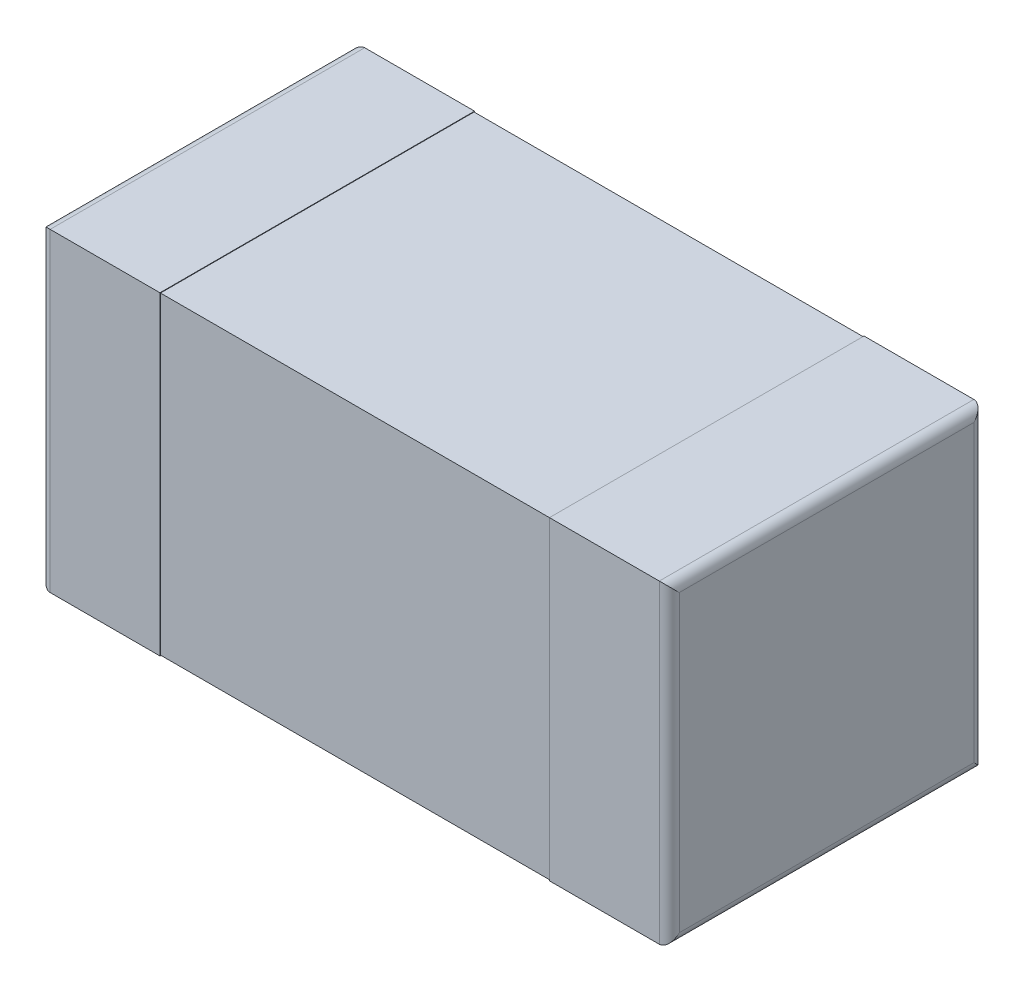
ISO-10303-21;
HEADER;
FILE_DESCRIPTION(('STEP AP214'),'2;1');
FILE_NAME('part.step','',(''),(''),'','','');
FILE_SCHEMA(('AUTOMOTIVE_DESIGN { 1 0 10303 214 1 1 1 1 }'));
ENDSEC;
DATA;
#1=APPLICATION_CONTEXT('core data for automotive mechanical design processes');
#2=APPLICATION_PROTOCOL_DEFINITION('international standard','automotive_design',2000,#1);
#3=PRODUCT_CONTEXT('',#1,'mechanical');
#4=PRODUCT('Part','Part','',(#3));
#5=PRODUCT_RELATED_PRODUCT_CATEGORY('part','',(#4));
#6=PRODUCT_DEFINITION_FORMATION('','',#4);
#7=PRODUCT_DEFINITION_CONTEXT('part definition',#1,'design');
#8=PRODUCT_DEFINITION('design','',#6,#7);
#9=PRODUCT_DEFINITION_SHAPE('','',#8);
#10=(LENGTH_UNIT() NAMED_UNIT(*) SI_UNIT(.MILLI.,.METRE.));
#11=(NAMED_UNIT(*) PLANE_ANGLE_UNIT() SI_UNIT($,.RADIAN.));
#12=(NAMED_UNIT(*) SI_UNIT($,.STERADIAN.) SOLID_ANGLE_UNIT());
#13=UNCERTAINTY_MEASURE_WITH_UNIT(LENGTH_MEASURE(1.E-05),#10,'distance_accuracy_value','');
#14=(GEOMETRIC_REPRESENTATION_CONTEXT(3) GLOBAL_UNCERTAINTY_ASSIGNED_CONTEXT((#13)) GLOBAL_UNIT_ASSIGNED_CONTEXT((#10,
#11,#12)) REPRESENTATION_CONTEXT('',''));
#15=CARTESIAN_POINT('',(0.,0.,0.));
#16=DIRECTION('',(0.,0.,1.));
#17=DIRECTION('',(1.,0.,0.));
#18=AXIS2_PLACEMENT_3D('',#15,#16,#17);
#19=CARTESIAN_POINT('',(3.1496,1.5494,1.6002));
#20=DIRECTION('',(0.,0.,-1.));
#21=DIRECTION('',(-1.,0.,0.));
#22=AXIS2_PLACEMENT_3D('',#19,#20,#21);
#23=CYLINDRICAL_SURFACE('',#22,0.0508);
#24=CARTESIAN_POINT('',(3.1496,1.5494,1.5494));
#25=DIRECTION('',(0.,0.707106781186548,-0.707106781186548));
#26=DIRECTION('',(0.,-0.707106781186548,-0.707106781186548));
#27=AXIS2_PLACEMENT_3D('',#24,#25,#26);
#28=ELLIPSE('',#27,0.0718420489685533,0.0508);
#29=CARTESIAN_POINT('',(3.1496,1.6002,1.6002));
#30=VERTEX_POINT('',#29);
#31=CARTESIAN_POINT('',(3.2004,1.5494,1.5494));
#32=VERTEX_POINT('',#31);
#33=EDGE_CURVE('E28',#30,#32,#28,.T.);
#34=ORIENTED_EDGE('',*,*,#33,.T.);
#35=DIRECTION('',(0.,0.,1.));
#36=VECTOR('',#35,1.);
#37=CARTESIAN_POINT('',(3.2004,1.5494,1.6002));
#38=LINE('',#37,#36);
#39=CARTESIAN_POINT('',(3.2004,1.5494,0.0508));
#40=VERTEX_POINT('',#39);
#41=EDGE_CURVE('E265',#40,#32,#38,.T.);
#42=ORIENTED_EDGE('',*,*,#41,.F.);
#43=CARTESIAN_POINT('',(3.1496,1.5494,0.0508));
#44=DIRECTION('',(0.,0.707106781186548,0.707106781186548));
#45=DIRECTION('',(0.,0.707106781186548,-0.707106781186548));
#46=AXIS2_PLACEMENT_3D('',#43,#44,#45);
#47=ELLIPSE('',#46,0.0718420489685533,0.0508);
#48=CARTESIAN_POINT('',(3.1496,1.6002,0.));
#49=VERTEX_POINT('',#48);
#50=EDGE_CURVE('E11',#40,#49,#47,.T.);
#51=ORIENTED_EDGE('',*,*,#50,.T.);
#52=DIRECTION('',(0.,0.,-1.));
#53=VECTOR('',#52,1.);
#54=CARTESIAN_POINT('',(3.1496,1.6002,1.6002));
#55=LINE('',#54,#53);
#56=EDGE_CURVE('E304',#30,#49,#55,.T.);
#57=ORIENTED_EDGE('',*,*,#56,.F.);
#58=EDGE_LOOP('',(#34,#42,#51,#57));
#59=FACE_BOUND('',#58,.T.);
#60=ADVANCED_FACE('F17',(#59),#23,.T.);
#61=CARTESIAN_POINT('',(3.1496,0.,0.0508));
#62=DIRECTION('',(0.,1.,0.));
#63=DIRECTION('',(0.,0.,1.));
#64=AXIS2_PLACEMENT_3D('',#61,#62,#63);
#65=CYLINDRICAL_SURFACE('',#64,0.0508);
#66=CARTESIAN_POINT('',(3.1496,0.0508,0.0508));
#67=DIRECTION('',(0.,0.707106781186548,-0.707106781186548));
#68=DIRECTION('',(0.,-0.707106781186548,-0.707106781186548));
#69=AXIS2_PLACEMENT_3D('',#66,#67,#68);
#70=ELLIPSE('',#69,0.0718420489685533,0.0508);
#71=CARTESIAN_POINT('',(3.2004,0.0508,0.0508));
#72=VERTEX_POINT('',#71);
#73=CARTESIAN_POINT('',(3.1496,0.,0.));
#74=VERTEX_POINT('',#73);
#75=EDGE_CURVE('E330',#72,#74,#70,.T.);
#76=ORIENTED_EDGE('',*,*,#75,.T.);
#77=DIRECTION('',(0.,-1.,0.));
#78=VECTOR('',#77,1.);
#79=CARTESIAN_POINT('',(3.1496,0.,0.));
#80=LINE('',#79,#78);
#81=EDGE_CURVE('E227',#49,#74,#80,.T.);
#82=ORIENTED_EDGE('',*,*,#81,.F.);
#83=ORIENTED_EDGE('',*,*,#50,.F.);
#84=DIRECTION('',(0.,1.,0.));
#85=VECTOR('',#84,1.);
#86=CARTESIAN_POINT('',(3.2004,0.,0.0508));
#87=LINE('',#86,#85);
#88=EDGE_CURVE('E261',#72,#40,#87,.T.);
#89=ORIENTED_EDGE('',*,*,#88,.F.);
#90=EDGE_LOOP('',(#76,#82,#83,#89));
#91=FACE_BOUND('',#90,.T.);
#92=ADVANCED_FACE('F392',(#91),#65,.T.);
#93=CARTESIAN_POINT('',(3.1496,0.,1.5494));
#94=DIRECTION('',(0.,-1.,0.));
#95=DIRECTION('',(0.,0.,-1.));
#96=AXIS2_PLACEMENT_3D('',#93,#94,#95);
#97=CYLINDRICAL_SURFACE('',#96,0.0508);
#98=CARTESIAN_POINT('',(3.1496,0.0508,1.5494));
#99=DIRECTION('',(0.,0.707106781186548,0.707106781186548));
#100=DIRECTION('',(0.,0.707106781186548,-0.707106781186548));
#101=AXIS2_PLACEMENT_3D('',#98,#99,#100);
#102=ELLIPSE('',#101,0.0718420489685533,0.0508);
#103=CARTESIAN_POINT('',(3.1496,0.,1.6002));
#104=VERTEX_POINT('',#103);
#105=CARTESIAN_POINT('',(3.2004,0.0508,1.5494));
#106=VERTEX_POINT('',#105);
#107=EDGE_CURVE('E42',#104,#106,#102,.T.);
#108=ORIENTED_EDGE('',*,*,#107,.T.);
#109=DIRECTION('',(0.,-1.,0.));
#110=VECTOR('',#109,1.);
#111=CARTESIAN_POINT('',(3.2004,0.,1.5494));
#112=LINE('',#111,#110);
#113=EDGE_CURVE('E287',#32,#106,#112,.T.);
#114=ORIENTED_EDGE('',*,*,#113,.F.);
#115=ORIENTED_EDGE('',*,*,#33,.F.);
#116=DIRECTION('',(0.,1.,0.));
#117=VECTOR('',#116,1.);
#118=CARTESIAN_POINT('',(3.1496,1.6002,1.6002));
#119=LINE('',#118,#117);
#120=EDGE_CURVE('E256',#104,#30,#119,.T.);
#121=ORIENTED_EDGE('',*,*,#120,.F.);
#122=EDGE_LOOP('',(#108,#114,#115,#121));
#123=FACE_BOUND('',#122,.T.);
#124=ADVANCED_FACE('F425',(#123),#97,.T.);
#125=CARTESIAN_POINT('',(3.1496,0.0508,1.6002));
#126=DIRECTION('',(0.,0.,-1.));
#127=DIRECTION('',(-1.,0.,0.));
#128=AXIS2_PLACEMENT_3D('',#125,#126,#127);
#129=CYLINDRICAL_SURFACE('',#128,0.0508);
#130=ORIENTED_EDGE('',*,*,#75,.F.);
#131=DIRECTION('',(0.,0.,-1.));
#132=VECTOR('',#131,1.);
#133=CARTESIAN_POINT('',(3.2004,0.0508,1.6002));
#134=LINE('',#133,#132);
#135=EDGE_CURVE('E282',#106,#72,#134,.T.);
#136=ORIENTED_EDGE('',*,*,#135,.F.);
#137=ORIENTED_EDGE('',*,*,#107,.F.);
#138=DIRECTION('',(0.,0.,1.));
#139=VECTOR('',#138,1.);
#140=CARTESIAN_POINT('',(3.1496,0.,1.6002));
#141=LINE('',#140,#139);
#142=EDGE_CURVE('E231',#74,#104,#141,.T.);
#143=ORIENTED_EDGE('',*,*,#142,.F.);
#144=EDGE_LOOP('',(#130,#136,#137,#143));
#145=FACE_BOUND('',#144,.T.);
#146=ADVANCED_FACE('F19',(#145),#129,.T.);
#147=CARTESIAN_POINT('',(0.0508,0.0508,1.6002));
#148=DIRECTION('',(0.,0.,-1.));
#149=DIRECTION('',(-1.,0.,0.));
#150=AXIS2_PLACEMENT_3D('',#147,#148,#149);
#151=CYLINDRICAL_SURFACE('',#150,0.0508);
#152=CARTESIAN_POINT('',(0.0508,0.0508,1.5494));
#153=DIRECTION('',(0.,-0.707106781186548,-0.707106781186548));
#154=DIRECTION('',(0.,0.707106781186548,-0.707106781186548));
#155=AXIS2_PLACEMENT_3D('',#152,#153,#154);
#156=ELLIPSE('',#155,0.0718420489685533,0.0508);
#157=CARTESIAN_POINT('',(0.0508,0.,1.6002));
#158=VERTEX_POINT('',#157);
#159=CARTESIAN_POINT('',(0.,0.0508,1.5494));
#160=VERTEX_POINT('',#159);
#161=EDGE_CURVE('E297',#158,#160,#156,.T.);
#162=ORIENTED_EDGE('',*,*,#161,.T.);
#163=DIRECTION('',(0.,0.,1.));
#164=VECTOR('',#163,1.);
#165=CARTESIAN_POINT('',(0.,0.0508,1.6002));
#166=LINE('',#165,#164);
#167=CARTESIAN_POINT('',(0.,0.0508,0.0508));
#168=VERTEX_POINT('',#167);
#169=EDGE_CURVE('E278',#168,#160,#166,.T.);
#170=ORIENTED_EDGE('',*,*,#169,.F.);
#171=CARTESIAN_POINT('',(0.0508,0.0508,0.0508));
#172=DIRECTION('',(0.,-0.707106781186548,0.707106781186548));
#173=DIRECTION('',(0.,-0.707106781186548,-0.707106781186548));
#174=AXIS2_PLACEMENT_3D('',#171,#172,#173);
#175=ELLIPSE('',#174,0.0718420489685533,0.0508);
#176=CARTESIAN_POINT('',(0.0508,0.,0.));
#177=VERTEX_POINT('',#176);
#178=EDGE_CURVE('E300',#168,#177,#175,.T.);
#179=ORIENTED_EDGE('',*,*,#178,.T.);
#180=DIRECTION('',(0.,0.,-1.));
#181=VECTOR('',#180,1.);
#182=CARTESIAN_POINT('',(0.0508,0.,1.6002));
#183=LINE('',#182,#181);
#184=EDGE_CURVE('E232',#158,#177,#183,.T.);
#185=ORIENTED_EDGE('',*,*,#184,.F.);
#186=EDGE_LOOP('',(#162,#170,#179,#185));
#187=FACE_BOUND('',#186,.T.);
#188=ADVANCED_FACE('F429',(#187),#151,.T.);
#189=CARTESIAN_POINT('',(0.0508,1.6002,0.0508));
#190=DIRECTION('',(0.,-1.,0.));
#191=DIRECTION('',(1.,0.,0.));
#192=AXIS2_PLACEMENT_3D('',#189,#190,#191);
#193=CYLINDRICAL_SURFACE('',#192,0.0508);
#194=CARTESIAN_POINT('',(0.0508,1.5494,0.0508));
#195=DIRECTION('',(0.,-0.707106781186548,-0.707106781186548));
#196=DIRECTION('',(0.,0.707106781186548,-0.707106781186548));
#197=AXIS2_PLACEMENT_3D('',#194,#195,#196);
#198=ELLIPSE('',#197,0.0718420489685533,0.0508);
#199=CARTESIAN_POINT('',(0.,1.5494,0.0508));
#200=VERTEX_POINT('',#199);
#201=CARTESIAN_POINT('',(0.0508,1.6002,0.));
#202=VERTEX_POINT('',#201);
#203=EDGE_CURVE('E180',#200,#202,#198,.T.);
#204=ORIENTED_EDGE('',*,*,#203,.T.);
#205=DIRECTION('',(0.,1.,0.));
#206=VECTOR('',#205,1.);
#207=CARTESIAN_POINT('',(0.0508,0.,0.));
#208=LINE('',#207,#206);
#209=EDGE_CURVE('E312',#177,#202,#208,.T.);
#210=ORIENTED_EDGE('',*,*,#209,.F.);
#211=ORIENTED_EDGE('',*,*,#178,.F.);
#212=DIRECTION('',(0.,-1.,0.));
#213=VECTOR('',#212,1.);
#214=CARTESIAN_POINT('',(0.,1.6002,0.0508));
#215=LINE('',#214,#213);
#216=EDGE_CURVE('E274',#200,#168,#215,.T.);
#217=ORIENTED_EDGE('',*,*,#216,.F.);
#218=EDGE_LOOP('',(#204,#210,#211,#217));
#219=FACE_BOUND('',#218,.T.);
#220=ADVANCED_FACE('F438',(#219),#193,.T.);
#221=CARTESIAN_POINT('',(0.0508,0.,1.5494));
#222=DIRECTION('',(0.,1.,0.));
#223=DIRECTION('',(-1.,0.,0.));
#224=AXIS2_PLACEMENT_3D('',#221,#222,#223);
#225=CYLINDRICAL_SURFACE('',#224,0.0508);
#226=CARTESIAN_POINT('',(0.0508,1.5494,1.5494));
#227=DIRECTION('',(0.,-0.707106781186548,0.707106781186548));
#228=DIRECTION('',(0.,-0.707106781186548,-0.707106781186548));
#229=AXIS2_PLACEMENT_3D('',#226,#227,#228);
#230=ELLIPSE('',#229,0.0718420489685533,0.0508);
#231=CARTESIAN_POINT('',(0.0508,1.6002,1.6002));
#232=VERTEX_POINT('',#231);
#233=CARTESIAN_POINT('',(0.,1.5494,1.5494));
#234=VERTEX_POINT('',#233);
#235=EDGE_CURVE('E301',#232,#234,#230,.T.);
#236=ORIENTED_EDGE('',*,*,#235,.T.);
#237=DIRECTION('',(0.,1.,0.));
#238=VECTOR('',#237,1.);
#239=CARTESIAN_POINT('',(0.,1.6002,1.5494));
#240=LINE('',#239,#238);
#241=EDGE_CURVE('E311',#160,#234,#240,.T.);
#242=ORIENTED_EDGE('',*,*,#241,.F.);
#243=ORIENTED_EDGE('',*,*,#161,.F.);
#244=DIRECTION('',(0.,-1.,0.));
#245=VECTOR('',#244,1.);
#246=CARTESIAN_POINT('',(0.0508,0.,1.6002));
#247=LINE('',#246,#245);
#248=EDGE_CURVE('E269',#232,#158,#247,.T.);
#249=ORIENTED_EDGE('',*,*,#248,.F.);
#250=EDGE_LOOP('',(#236,#242,#243,#249));
#251=FACE_BOUND('',#250,.T.);
#252=ADVANCED_FACE('F434',(#251),#225,.T.);
#253=CARTESIAN_POINT('',(0.0508,1.5494,1.6002));
#254=DIRECTION('',(0.,0.,-1.));
#255=DIRECTION('',(-1.,0.,0.));
#256=AXIS2_PLACEMENT_3D('',#253,#254,#255);
#257=CYLINDRICAL_SURFACE('',#256,0.0508);
#258=ORIENTED_EDGE('',*,*,#203,.F.);
#259=DIRECTION('',(0.,0.,-1.));
#260=VECTOR('',#259,1.);
#261=CARTESIAN_POINT('',(0.,1.5494,1.6002));
#262=LINE('',#261,#260);
#263=EDGE_CURVE('E266',#234,#200,#262,.T.);
#264=ORIENTED_EDGE('',*,*,#263,.F.);
#265=ORIENTED_EDGE('',*,*,#235,.F.);
#266=DIRECTION('',(0.,0.,1.));
#267=VECTOR('',#266,1.);
#268=CARTESIAN_POINT('',(0.0508,1.6002,1.6002));
#269=LINE('',#268,#267);
#270=EDGE_CURVE('E21',#202,#232,#269,.T.);
#271=ORIENTED_EDGE('',*,*,#270,.F.);
#272=EDGE_LOOP('',(#258,#264,#265,#271));
#273=FACE_BOUND('',#272,.T.);
#274=ADVANCED_FACE('F437',(#273),#257,.T.);
#275=CARTESIAN_POINT('',(0.6096,3.91967348640164,0.00253999999999982));
#276=DIRECTION('',(0.,0.,-1.));
#277=DIRECTION('',(0.,-1.,0.));
#278=AXIS2_PLACEMENT_3D('',#275,#276,#277);
#279=PLANE('',#278);
#280=DIRECTION('',(-1.,0.,0.));
#281=VECTOR('',#280,1.);
#282=CARTESIAN_POINT('',(2.5908,0.00254000000000018,0.00253999999999966));
#283=LINE('',#282,#281);
#284=CARTESIAN_POINT('',(2.5908,0.00253999999999966,0.00253999999999982));
#285=VERTEX_POINT('',#284);
#286=CARTESIAN_POINT('',(0.6096,0.00253999999999966,0.00253999999999982));
#287=VERTEX_POINT('',#286);
#288=EDGE_CURVE('E217',#285,#287,#283,.T.);
#289=ORIENTED_EDGE('',*,*,#288,.T.);
#290=DIRECTION('',(0.,-1.,0.));
#291=VECTOR('',#290,1.);
#292=CARTESIAN_POINT('',(0.6096,3.91967348640164,0.00253999999999982));
#293=LINE('',#292,#291);
#294=CARTESIAN_POINT('',(0.6096,1.59766,0.00253999999999982));
#295=VERTEX_POINT('',#294);
#296=EDGE_CURVE('E286',#295,#287,#293,.T.);
#297=ORIENTED_EDGE('',*,*,#296,.F.);
#298=DIRECTION('',(1.,0.,0.));
#299=VECTOR('',#298,1.);
#300=CARTESIAN_POINT('',(0.6096,1.59766,0.00253999999999966));
#301=LINE('',#300,#299);
#302=CARTESIAN_POINT('',(2.5908,1.59766,0.00253999999999982));
#303=VERTEX_POINT('',#302);
#304=EDGE_CURVE('E333',#295,#303,#301,.T.);
#305=ORIENTED_EDGE('',*,*,#304,.T.);
#306=DIRECTION('',(0.,-1.,0.));
#307=VECTOR('',#306,1.);
#308=CARTESIAN_POINT('',(2.5908,3.91967348640164,0.00253999999999982));
#309=LINE('',#308,#307);
#310=EDGE_CURVE('E205',#303,#285,#309,.T.);
#311=ORIENTED_EDGE('',*,*,#310,.T.);
#312=EDGE_LOOP('',(#289,#297,#305,#311));
#313=FACE_BOUND('',#312,.T.);
#314=ADVANCED_FACE('F454',(#313),#279,.T.);
#315=CARTESIAN_POINT('',(0.,0.,1.59766));
#316=DIRECTION('',(0.,0.,-1.));
#317=DIRECTION('',(0.,-1.,0.));
#318=AXIS2_PLACEMENT_3D('',#315,#316,#317);
#319=PLANE('',#318);
#320=DIRECTION('',(0.,-1.,0.));
#321=VECTOR('',#320,1.);
#322=CARTESIAN_POINT('',(2.5908,1.6002,1.59766));
#323=LINE('',#322,#321);
#324=CARTESIAN_POINT('',(2.5908,1.59766,1.59766));
#325=VERTEX_POINT('',#324);
#326=CARTESIAN_POINT('',(2.5908,0.00254000000000018,1.59766));
#327=VERTEX_POINT('',#326);
#328=EDGE_CURVE('E76',#325,#327,#323,.T.);
#329=ORIENTED_EDGE('',*,*,#328,.F.);
#330=DIRECTION('',(1.,0.,0.));
#331=VECTOR('',#330,1.);
#332=CARTESIAN_POINT('',(0.6096,1.59766,1.59766));
#333=LINE('',#332,#331);
#334=CARTESIAN_POINT('',(0.6096,1.59766,1.59766));
#335=VERTEX_POINT('',#334);
#336=EDGE_CURVE('E293',#335,#325,#333,.T.);
#337=ORIENTED_EDGE('',*,*,#336,.F.);
#338=DIRECTION('',(0.,1.,0.));
#339=VECTOR('',#338,1.);
#340=CARTESIAN_POINT('',(0.6096,0.,1.59766));
#341=LINE('',#340,#339);
#342=CARTESIAN_POINT('',(0.6096,0.00253999999999993,1.59766));
#343=VERTEX_POINT('',#342);
#344=EDGE_CURVE('E91',#343,#335,#341,.T.);
#345=ORIENTED_EDGE('',*,*,#344,.F.);
#346=DIRECTION('',(-1.,0.,0.));
#347=VECTOR('',#346,1.);
#348=CARTESIAN_POINT('',(2.5908,0.00254000000000018,1.59766));
#349=LINE('',#348,#347);
#350=EDGE_CURVE('E208',#327,#343,#349,.T.);
#351=ORIENTED_EDGE('',*,*,#350,.F.);
#352=EDGE_LOOP('',(#329,#337,#345,#351));
#353=FACE_BOUND('',#352,.T.);
#354=ADVANCED_FACE('F209',(#353),#319,.F.);
#355=CARTESIAN_POINT('',(2.5908,1.6002,1.59766));
#356=DIRECTION('',(-1.,0.,0.));
#357=DIRECTION('',(0.,0.,1.));
#358=AXIS2_PLACEMENT_3D('',#355,#356,#357);
#359=PLANE('',#358);
#360=DIRECTION('',(0.,0.,1.));
#361=VECTOR('',#360,1.);
#362=CARTESIAN_POINT('',(2.5908,0.,1.59766));
#363=LINE('',#362,#361);
#364=CARTESIAN_POINT('',(2.5908,0.,0.));
#365=VERTEX_POINT('',#364);
#366=CARTESIAN_POINT('',(2.5908,0.,1.6002));
#367=VERTEX_POINT('',#366);
#368=EDGE_CURVE('E340',#365,#367,#363,.T.);
#369=ORIENTED_EDGE('',*,*,#368,.T.);
#370=DIRECTION('',(0.,-1.,0.));
#371=VECTOR('',#370,1.);
#372=CARTESIAN_POINT('',(2.5908,1.6002,1.6002));
#373=LINE('',#372,#371);
#374=CARTESIAN_POINT('',(2.5908,1.6002,1.6002));
#375=VERTEX_POINT('',#374);
#376=EDGE_CURVE('E259',#375,#367,#373,.T.);
#377=ORIENTED_EDGE('',*,*,#376,.F.);
#378=DIRECTION('',(0.,0.,1.));
#379=VECTOR('',#378,1.);
#380=CARTESIAN_POINT('',(2.5908,1.6002,1.59766));
#381=LINE('',#380,#379);
#382=CARTESIAN_POINT('',(2.5908,1.6002,0.));
#383=VERTEX_POINT('',#382);
#384=EDGE_CURVE('E124',#383,#375,#381,.T.);
#385=ORIENTED_EDGE('',*,*,#384,.F.);
#386=DIRECTION('',(0.,1.,0.));
#387=VECTOR('',#386,1.);
#388=CARTESIAN_POINT('',(2.5908,0.,0.));
#389=LINE('',#388,#387);
#390=EDGE_CURVE('E292',#365,#383,#389,.T.);
#391=ORIENTED_EDGE('',*,*,#390,.F.);
#392=EDGE_LOOP('',(#369,#377,#385,#391));
#393=FACE_BOUND('',#392,.T.);
#394=ORIENTED_EDGE('',*,*,#310,.F.);
#395=DIRECTION('',(0.,0.,1.));
#396=VECTOR('',#395,1.);
#397=CARTESIAN_POINT('',(2.5908,1.59766,-2.32201348640164));
#398=LINE('',#397,#396);
#399=EDGE_CURVE('E202',#303,#325,#398,.T.);
#400=ORIENTED_EDGE('',*,*,#399,.T.);
#401=ORIENTED_EDGE('',*,*,#328,.T.);
#402=DIRECTION('',(0.,0.,1.));
#403=VECTOR('',#402,1.);
#404=CARTESIAN_POINT('',(2.5908,0.00254000000000018,-2.32201348640164));
#405=LINE('',#404,#403);
#406=EDGE_CURVE('E199',#285,#327,#405,.T.);
#407=ORIENTED_EDGE('',*,*,#406,.F.);
#408=EDGE_LOOP('',(#394,#400,#401,#407));
#409=FACE_BOUND('',#408,.T.);
#410=ADVANCED_FACE('F197',(#393,#409),#359,.T.);
#411=CARTESIAN_POINT('',(0.6096,0.,1.59766));
#412=DIRECTION('',(1.,0.,0.));
#413=DIRECTION('',(0.,1.,0.));
#414=AXIS2_PLACEMENT_3D('',#411,#412,#413);
#415=PLANE('',#414);
#416=DIRECTION('',(0.,0.,1.));
#417=VECTOR('',#416,1.);
#418=CARTESIAN_POINT('',(0.6096,1.6002,1.59766));
#419=LINE('',#418,#417);
#420=CARTESIAN_POINT('',(0.6096,1.6002,0.));
#421=VERTEX_POINT('',#420);
#422=CARTESIAN_POINT('',(0.6096,1.6002,1.6002));
#423=VERTEX_POINT('',#422);
#424=EDGE_CURVE('E190',#421,#423,#419,.T.);
#425=ORIENTED_EDGE('',*,*,#424,.T.);
#426=DIRECTION('',(0.,1.,0.));
#427=VECTOR('',#426,1.);
#428=CARTESIAN_POINT('',(0.6096,0.,1.6002));
#429=LINE('',#428,#427);
#430=CARTESIAN_POINT('',(0.6096,0.,1.6002));
#431=VERTEX_POINT('',#430);
#432=EDGE_CURVE('E260',#431,#423,#429,.T.);
#433=ORIENTED_EDGE('',*,*,#432,.F.);
#434=DIRECTION('',(0.,0.,1.));
#435=VECTOR('',#434,1.);
#436=CARTESIAN_POINT('',(0.6096,0.,1.59766));
#437=LINE('',#436,#435);
#438=CARTESIAN_POINT('',(0.6096,0.,0.));
#439=VERTEX_POINT('',#438);
#440=EDGE_CURVE('E229',#439,#431,#437,.T.);
#441=ORIENTED_EDGE('',*,*,#440,.F.);
#442=DIRECTION('',(0.,-1.,0.));
#443=VECTOR('',#442,1.);
#444=CARTESIAN_POINT('',(0.6096,0.,0.));
#445=LINE('',#444,#443);
#446=EDGE_CURVE('E224',#421,#439,#445,.T.);
#447=ORIENTED_EDGE('',*,*,#446,.F.);
#448=EDGE_LOOP('',(#425,#433,#441,#447));
#449=FACE_BOUND('',#448,.T.);
#450=DIRECTION('',(0.,0.,1.));
#451=VECTOR('',#450,1.);
#452=CARTESIAN_POINT('',(0.6096,1.59766,-2.32201348640164));
#453=LINE('',#452,#451);
#454=EDGE_CURVE('E296',#295,#335,#453,.T.);
#455=ORIENTED_EDGE('',*,*,#454,.F.);
#456=ORIENTED_EDGE('',*,*,#296,.T.);
#457=DIRECTION('',(0.,0.,1.));
#458=VECTOR('',#457,1.);
#459=CARTESIAN_POINT('',(0.6096,0.00253999999999993,-2.32201348640164));
#460=LINE('',#459,#458);
#461=EDGE_CURVE('E213',#287,#343,#460,.T.);
#462=ORIENTED_EDGE('',*,*,#461,.T.);
#463=ORIENTED_EDGE('',*,*,#344,.T.);
#464=EDGE_LOOP('',(#455,#456,#462,#463));
#465=FACE_BOUND('',#464,.T.);
#466=ADVANCED_FACE('F433',(#449,#465),#415,.T.);
#467=CARTESIAN_POINT('',(3.2004,0.,1.6002));
#468=DIRECTION('',(-1.,0.,0.));
#469=DIRECTION('',(0.,0.,1.));
#470=AXIS2_PLACEMENT_3D('',#467,#468,#469);
#471=PLANE('',#470);
#472=ORIENTED_EDGE('',*,*,#88,.T.);
#473=ORIENTED_EDGE('',*,*,#41,.T.);
#474=ORIENTED_EDGE('',*,*,#113,.T.);
#475=ORIENTED_EDGE('',*,*,#135,.T.);
#476=EDGE_LOOP('',(#472,#473,#474,#475));
#477=FACE_BOUND('',#476,.T.);
#478=ADVANCED_FACE('F446',(#477),#471,.F.);
#479=CARTESIAN_POINT('',(0.,1.6002,1.6002));
#480=DIRECTION('',(1.,0.,0.));
#481=DIRECTION('',(0.,1.,0.));
#482=AXIS2_PLACEMENT_3D('',#479,#480,#481);
#483=PLANE('',#482);
#484=ORIENTED_EDGE('',*,*,#216,.T.);
#485=ORIENTED_EDGE('',*,*,#169,.T.);
#486=ORIENTED_EDGE('',*,*,#241,.T.);
#487=ORIENTED_EDGE('',*,*,#263,.T.);
#488=EDGE_LOOP('',(#484,#485,#486,#487));
#489=FACE_BOUND('',#488,.T.);
#490=ADVANCED_FACE('F448',(#489),#483,.F.);
#491=CARTESIAN_POINT('',(0.,0.,1.6002));
#492=DIRECTION('',(0.,0.,1.));
#493=DIRECTION('',(1.,0.,0.));
#494=AXIS2_PLACEMENT_3D('',#491,#492,#493);
#495=PLANE('',#494);
#496=DIRECTION('',(1.,0.,0.));
#497=VECTOR('',#496,1.);
#498=CARTESIAN_POINT('',(0.,0.,1.6002));
#499=LINE('',#498,#497);
#500=EDGE_CURVE('E241',#367,#104,#499,.T.);
#501=ORIENTED_EDGE('',*,*,#500,.T.);
#502=ORIENTED_EDGE('',*,*,#120,.T.);
#503=DIRECTION('',(-1.,0.,0.));
#504=VECTOR('',#503,1.);
#505=CARTESIAN_POINT('',(3.2004,1.6002,1.6002));
#506=LINE('',#505,#504);
#507=EDGE_CURVE('E307',#30,#375,#506,.T.);
#508=ORIENTED_EDGE('',*,*,#507,.T.);
#509=ORIENTED_EDGE('',*,*,#376,.T.);
#510=EDGE_LOOP('',(#501,#502,#508,#509));
#511=FACE_BOUND('',#510,.T.);
#512=ADVANCED_FACE('F465',(#511),#495,.T.);
#513=CARTESIAN_POINT('',(0.,0.,1.6002));
#514=DIRECTION('',(0.,0.,1.));
#515=DIRECTION('',(1.,0.,0.));
#516=AXIS2_PLACEMENT_3D('',#513,#514,#515);
#517=PLANE('',#516);
#518=DIRECTION('',(-1.,0.,0.));
#519=VECTOR('',#518,1.);
#520=CARTESIAN_POINT('',(3.2004,1.6002,1.6002));
#521=LINE('',#520,#519);
#522=EDGE_CURVE('E270',#423,#232,#521,.T.);
#523=ORIENTED_EDGE('',*,*,#522,.T.);
#524=ORIENTED_EDGE('',*,*,#248,.T.);
#525=DIRECTION('',(1.,0.,0.));
#526=VECTOR('',#525,1.);
#527=CARTESIAN_POINT('',(0.,0.,1.6002));
#528=LINE('',#527,#526);
#529=EDGE_CURVE('E245',#158,#431,#528,.T.);
#530=ORIENTED_EDGE('',*,*,#529,.T.);
#531=ORIENTED_EDGE('',*,*,#432,.T.);
#532=EDGE_LOOP('',(#523,#524,#530,#531));
#533=FACE_BOUND('',#532,.T.);
#534=ADVANCED_FACE('F415',(#533),#517,.T.);
#535=CARTESIAN_POINT('',(3.2004,1.6002,1.6002));
#536=DIRECTION('',(0.,-1.,0.));
#537=DIRECTION('',(0.,0.,-1.));
#538=AXIS2_PLACEMENT_3D('',#535,#536,#537);
#539=PLANE('',#538);
#540=DIRECTION('',(-1.,0.,0.));
#541=VECTOR('',#540,1.);
#542=CARTESIAN_POINT('',(3.2004,1.6002,0.));
#543=LINE('',#542,#541);
#544=EDGE_CURVE('E316',#421,#202,#543,.T.);
#545=ORIENTED_EDGE('',*,*,#544,.T.);
#546=ORIENTED_EDGE('',*,*,#270,.T.);
#547=ORIENTED_EDGE('',*,*,#522,.F.);
#548=ORIENTED_EDGE('',*,*,#424,.F.);
#549=EDGE_LOOP('',(#545,#546,#547,#548));
#550=FACE_BOUND('',#549,.T.);
#551=ADVANCED_FACE('F406',(#550),#539,.F.);
#552=CARTESIAN_POINT('',(0.,0.,1.6002));
#553=DIRECTION('',(0.,1.,0.));
#554=DIRECTION('',(1.,0.,0.));
#555=AXIS2_PLACEMENT_3D('',#552,#553,#554);
#556=PLANE('',#555);
#557=DIRECTION('',(1.,0.,0.));
#558=VECTOR('',#557,1.);
#559=CARTESIAN_POINT('',(0.,0.,0.));
#560=LINE('',#559,#558);
#561=EDGE_CURVE('E288',#365,#74,#560,.T.);
#562=ORIENTED_EDGE('',*,*,#561,.T.);
#563=ORIENTED_EDGE('',*,*,#142,.T.);
#564=ORIENTED_EDGE('',*,*,#500,.F.);
#565=ORIENTED_EDGE('',*,*,#368,.F.);
#566=EDGE_LOOP('',(#562,#563,#564,#565));
#567=FACE_BOUND('',#566,.T.);
#568=ADVANCED_FACE('F403',(#567),#556,.F.);
#569=CARTESIAN_POINT('',(0.,0.,1.6002));
#570=DIRECTION('',(0.,1.,0.));
#571=DIRECTION('',(1.,0.,0.));
#572=AXIS2_PLACEMENT_3D('',#569,#570,#571);
#573=PLANE('',#572);
#574=ORIENTED_EDGE('',*,*,#529,.F.);
#575=ORIENTED_EDGE('',*,*,#184,.T.);
#576=DIRECTION('',(1.,0.,0.));
#577=VECTOR('',#576,1.);
#578=CARTESIAN_POINT('',(0.,0.,0.));
#579=LINE('',#578,#577);
#580=EDGE_CURVE('E317',#177,#439,#579,.T.);
#581=ORIENTED_EDGE('',*,*,#580,.T.);
#582=ORIENTED_EDGE('',*,*,#440,.T.);
#583=EDGE_LOOP('',(#574,#575,#581,#582));
#584=FACE_BOUND('',#583,.T.);
#585=ADVANCED_FACE('F405',(#584),#573,.F.);
#586=CARTESIAN_POINT('',(3.2004,1.6002,1.6002));
#587=DIRECTION('',(0.,-1.,0.));
#588=DIRECTION('',(0.,0.,-1.));
#589=AXIS2_PLACEMENT_3D('',#586,#587,#588);
#590=PLANE('',#589);
#591=ORIENTED_EDGE('',*,*,#507,.F.);
#592=ORIENTED_EDGE('',*,*,#56,.T.);
#593=DIRECTION('',(-1.,0.,0.));
#594=VECTOR('',#593,1.);
#595=CARTESIAN_POINT('',(3.2004,1.6002,0.));
#596=LINE('',#595,#594);
#597=EDGE_CURVE('E374',#49,#383,#596,.T.);
#598=ORIENTED_EDGE('',*,*,#597,.T.);
#599=ORIENTED_EDGE('',*,*,#384,.T.);
#600=EDGE_LOOP('',(#591,#592,#598,#599));
#601=FACE_BOUND('',#600,.T.);
#602=ADVANCED_FACE('F388',(#601),#590,.F.);
#603=CARTESIAN_POINT('',(0.6096,1.59766,-2.32201348640164));
#604=DIRECTION('',(0.,-1.,0.));
#605=DIRECTION('',(0.,0.,-1.));
#606=AXIS2_PLACEMENT_3D('',#603,#604,#605);
#607=PLANE('',#606);
#608=ORIENTED_EDGE('',*,*,#304,.F.);
#609=ORIENTED_EDGE('',*,*,#454,.T.);
#610=ORIENTED_EDGE('',*,*,#336,.T.);
#611=ORIENTED_EDGE('',*,*,#399,.F.);
#612=EDGE_LOOP('',(#608,#609,#610,#611));
#613=FACE_BOUND('',#612,.T.);
#614=ADVANCED_FACE('F443',(#613),#607,.F.);
#615=CARTESIAN_POINT('',(2.5908,0.00254000000000018,-2.32201348640164));
#616=DIRECTION('',(0.,1.,0.));
#617=DIRECTION('',(1.,0.,0.));
#618=AXIS2_PLACEMENT_3D('',#615,#616,#617);
#619=PLANE('',#618);
#620=ORIENTED_EDGE('',*,*,#288,.F.);
#621=ORIENTED_EDGE('',*,*,#406,.T.);
#622=ORIENTED_EDGE('',*,*,#350,.T.);
#623=ORIENTED_EDGE('',*,*,#461,.F.);
#624=EDGE_LOOP('',(#620,#621,#622,#623));
#625=FACE_BOUND('',#624,.T.);
#626=ADVANCED_FACE('F215',(#625),#619,.F.);
#627=CARTESIAN_POINT('',(0.,0.,0.));
#628=DIRECTION('',(0.,0.,1.));
#629=DIRECTION('',(1.,0.,0.));
#630=AXIS2_PLACEMENT_3D('',#627,#628,#629);
#631=PLANE('',#630);
#632=ORIENTED_EDGE('',*,*,#580,.F.);
#633=ORIENTED_EDGE('',*,*,#209,.T.);
#634=ORIENTED_EDGE('',*,*,#544,.F.);
#635=ORIENTED_EDGE('',*,*,#446,.T.);
#636=EDGE_LOOP('',(#632,#633,#634,#635));
#637=FACE_BOUND('',#636,.T.);
#638=ADVANCED_FACE('F442',(#637),#631,.F.);
#639=CARTESIAN_POINT('',(0.,0.,0.));
#640=DIRECTION('',(0.,0.,1.));
#641=DIRECTION('',(1.,0.,0.));
#642=AXIS2_PLACEMENT_3D('',#639,#640,#641);
#643=PLANE('',#642);
#644=ORIENTED_EDGE('',*,*,#597,.F.);
#645=ORIENTED_EDGE('',*,*,#81,.T.);
#646=ORIENTED_EDGE('',*,*,#561,.F.);
#647=ORIENTED_EDGE('',*,*,#390,.T.);
#648=EDGE_LOOP('',(#644,#645,#646,#647));
#649=FACE_BOUND('',#648,.T.);
#650=ADVANCED_FACE('F384',(#649),#643,.F.);
#651=CLOSED_SHELL('',(#60,#92,#124,#146,#188,#220,#252,#274,#314,#354,#410,#466,#478,#490,#512,
#534,#551,#568,#585,#602,#614,#626,#638,#650));
#652=MANIFOLD_SOLID_BREP('B1',#651);
#653=ADVANCED_BREP_SHAPE_REPRESENTATION('',(#18,#652),#14);
#654=SHAPE_DEFINITION_REPRESENTATION(#9,#653);
ENDSEC;
END-ISO-10303-21;
